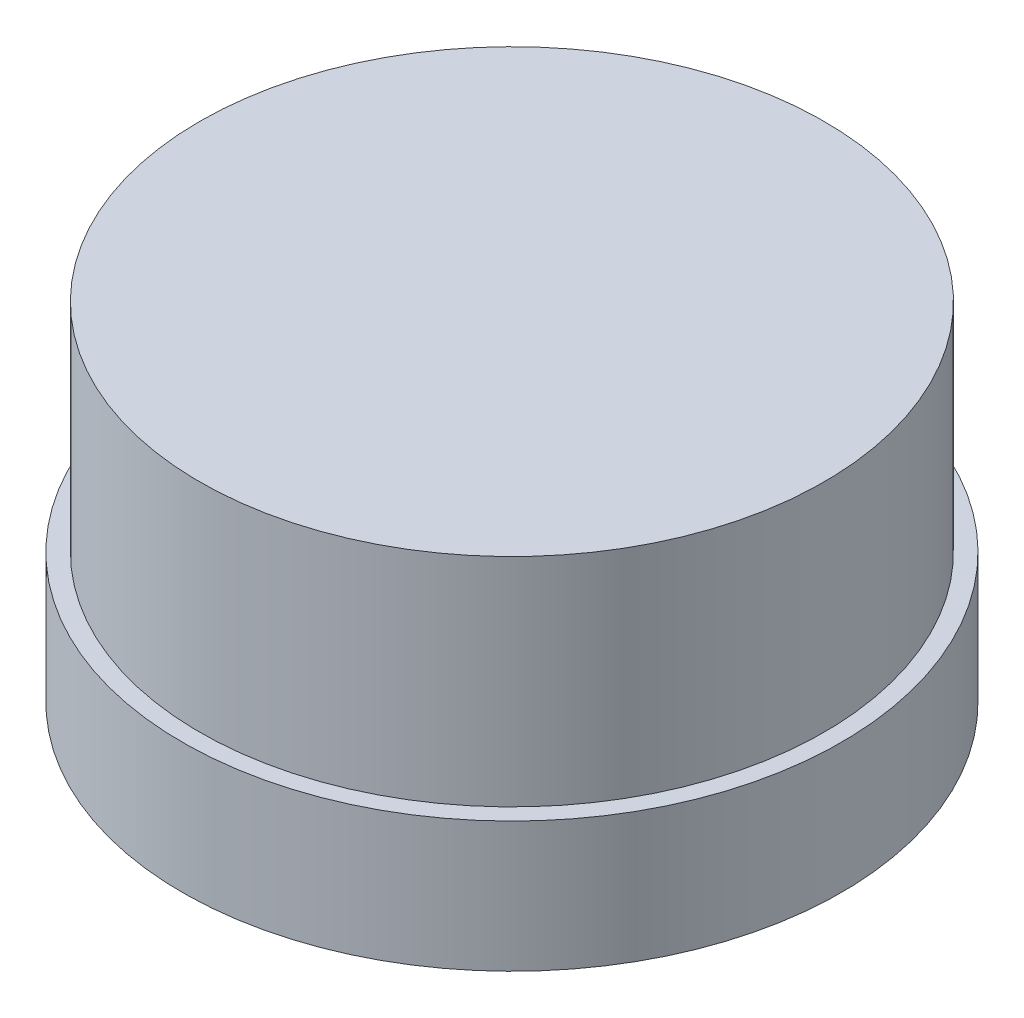
ISO-10303-21;
HEADER;
FILE_DESCRIPTION(('STEP AP214'),'2;1');
FILE_NAME('part.step','',(''),(''),'','','');
FILE_SCHEMA(('AUTOMOTIVE_DESIGN { 1 0 10303 214 1 1 1 1 }'));
ENDSEC;
DATA;
#1=APPLICATION_CONTEXT('core data for automotive mechanical design processes');
#2=APPLICATION_PROTOCOL_DEFINITION('international standard','automotive_design',2000,#1);
#3=PRODUCT_CONTEXT('',#1,'mechanical');
#4=PRODUCT('Part','Part','',(#3));
#5=PRODUCT_RELATED_PRODUCT_CATEGORY('part','',(#4));
#6=PRODUCT_DEFINITION_FORMATION('','',#4);
#7=PRODUCT_DEFINITION_CONTEXT('part definition',#1,'design');
#8=PRODUCT_DEFINITION('design','',#6,#7);
#9=PRODUCT_DEFINITION_SHAPE('','',#8);
#10=(LENGTH_UNIT() NAMED_UNIT(*) SI_UNIT(.MILLI.,.METRE.));
#11=(NAMED_UNIT(*) PLANE_ANGLE_UNIT() SI_UNIT($,.RADIAN.));
#12=(NAMED_UNIT(*) SI_UNIT($,.STERADIAN.) SOLID_ANGLE_UNIT());
#13=UNCERTAINTY_MEASURE_WITH_UNIT(LENGTH_MEASURE(1.E-05),#10,'distance_accuracy_value','');
#14=(GEOMETRIC_REPRESENTATION_CONTEXT(3) GLOBAL_UNCERTAINTY_ASSIGNED_CONTEXT((#13)) GLOBAL_UNIT_ASSIGNED_CONTEXT((#10,
#11,#12)) REPRESENTATION_CONTEXT('',''));
#15=CARTESIAN_POINT('',(0.,0.,0.));
#16=DIRECTION('',(0.,0.,1.));
#17=DIRECTION('',(1.,0.,0.));
#18=AXIS2_PLACEMENT_3D('',#15,#16,#17);
#19=CARTESIAN_POINT('',(0.,0.,0.));
#20=DIRECTION('',(0.,1.,0.));
#21=DIRECTION('',(-1.,0.,0.));
#22=AXIS2_PLACEMENT_3D('',#19,#20,#21);
#23=PLANE('',#22);
#24=CARTESIAN_POINT('',(0.,0.,0.));
#25=DIRECTION('',(0.,1.,0.));
#26=DIRECTION('',(-1.,0.,0.));
#27=AXIS2_PLACEMENT_3D('',#24,#25,#26);
#28=CIRCLE('',#27,38.);
#29=CARTESIAN_POINT('',(-38.,0.,0.));
#30=VERTEX_POINT('',#29);
#31=EDGE_CURVE('E10',#30,#30,#28,.T.);
#32=ORIENTED_EDGE('',*,*,#31,.F.);
#33=EDGE_LOOP('',(#32));
#34=FACE_BOUND('',#33,.T.);
#35=ADVANCED_FACE('F39',(#34),#23,.F.);
#36=CARTESIAN_POINT('',(0.,40.,0.));
#37=DIRECTION('',(0.,1.,0.));
#38=DIRECTION('',(-1.,0.,0.));
#39=AXIS2_PLACEMENT_3D('',#36,#37,#38);
#40=CYLINDRICAL_SURFACE('',#39,38.);
#41=CARTESIAN_POINT('',(0.,15.,0.));
#42=DIRECTION('',(0.,1.,0.));
#43=DIRECTION('',(-1.,0.,0.));
#44=AXIS2_PLACEMENT_3D('',#41,#42,#43);
#45=CIRCLE('',#44,38.);
#46=CARTESIAN_POINT('',(-38.,15.,0.));
#47=VERTEX_POINT('',#46);
#48=EDGE_CURVE('E45',#47,#47,#45,.T.);
#49=ORIENTED_EDGE('',*,*,#48,.F.);
#50=EDGE_LOOP('',(#49));
#51=FACE_BOUND('',#50,.T.);
#52=ORIENTED_EDGE('',*,*,#31,.T.);
#53=EDGE_LOOP('',(#52));
#54=FACE_BOUND('',#53,.T.);
#55=ADVANCED_FACE('F69',(#51,#54),#40,.T.);
#56=CARTESIAN_POINT('',(38.,15.,0.));
#57=DIRECTION('',(0.,-1.,0.));
#58=DIRECTION('',(1.,0.,0.));
#59=AXIS2_PLACEMENT_3D('',#56,#57,#58);
#60=PLANE('',#59);
#61=CARTESIAN_POINT('',(0.,15.,0.));
#62=DIRECTION('',(0.,1.,0.));
#63=DIRECTION('',(-1.,0.,0.));
#64=AXIS2_PLACEMENT_3D('',#61,#62,#63);
#65=CIRCLE('',#64,36.);
#66=CARTESIAN_POINT('',(-36.,15.,0.));
#67=VERTEX_POINT('',#66);
#68=EDGE_CURVE('E49',#67,#67,#65,.T.);
#69=ORIENTED_EDGE('',*,*,#68,.F.);
#70=EDGE_LOOP('',(#69));
#71=FACE_BOUND('',#70,.T.);
#72=ORIENTED_EDGE('',*,*,#48,.T.);
#73=EDGE_LOOP('',(#72));
#74=FACE_BOUND('',#73,.T.);
#75=ADVANCED_FACE('F64',(#71,#74),#60,.F.);
#76=CARTESIAN_POINT('',(0.,40.,0.));
#77=DIRECTION('',(0.,1.,0.));
#78=DIRECTION('',(-1.,0.,0.));
#79=AXIS2_PLACEMENT_3D('',#76,#77,#78);
#80=CYLINDRICAL_SURFACE('',#79,36.);
#81=CARTESIAN_POINT('',(0.,40.,0.));
#82=DIRECTION('',(0.,1.,0.));
#83=DIRECTION('',(-1.,0.,0.));
#84=AXIS2_PLACEMENT_3D('',#81,#82,#83);
#85=CIRCLE('',#84,36.);
#86=CARTESIAN_POINT('',(-36.,40.,0.));
#87=VERTEX_POINT('',#86);
#88=EDGE_CURVE('E53',#87,#87,#85,.T.);
#89=ORIENTED_EDGE('',*,*,#88,.F.);
#90=EDGE_LOOP('',(#89));
#91=FACE_BOUND('',#90,.T.);
#92=ORIENTED_EDGE('',*,*,#68,.T.);
#93=EDGE_LOOP('',(#92));
#94=FACE_BOUND('',#93,.T.);
#95=ADVANCED_FACE('F61',(#91,#94),#80,.T.);
#96=CARTESIAN_POINT('',(36.,40.,0.));
#97=DIRECTION('',(0.,-1.,0.));
#98=DIRECTION('',(1.,0.,0.));
#99=AXIS2_PLACEMENT_3D('',#96,#97,#98);
#100=PLANE('',#99);
#101=ORIENTED_EDGE('',*,*,#88,.T.);
#102=EDGE_LOOP('',(#101));
#103=FACE_BOUND('',#102,.T.);
#104=ADVANCED_FACE('F59',(#103),#100,.F.);
#105=CLOSED_SHELL('',(#35,#55,#75,#95,#104));
#106=MANIFOLD_SOLID_BREP('B2',#105);
#107=ADVANCED_BREP_SHAPE_REPRESENTATION('',(#18,#106),#14);
#108=SHAPE_DEFINITION_REPRESENTATION(#9,#107);
ENDSEC;
END-ISO-10303-21;
